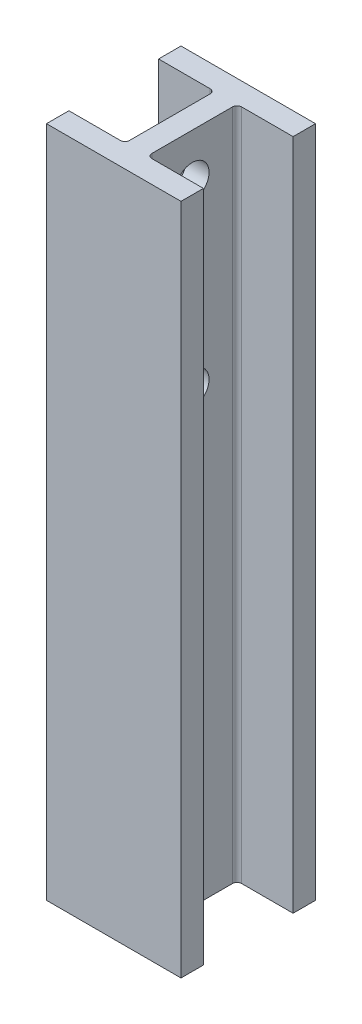
ISO-10303-21;
HEADER;
FILE_DESCRIPTION(('STEP AP214'),'2;1');
FILE_NAME('part.step','',(''),(''),'','','');
FILE_SCHEMA(('AUTOMOTIVE_DESIGN { 1 0 10303 214 1 1 1 1 }'));
ENDSEC;
DATA;
#1=APPLICATION_CONTEXT('core data for automotive mechanical design processes');
#2=APPLICATION_PROTOCOL_DEFINITION('international standard','automotive_design',2000,#1);
#3=PRODUCT_CONTEXT('',#1,'mechanical');
#4=PRODUCT('Part','Part','',(#3));
#5=PRODUCT_RELATED_PRODUCT_CATEGORY('part','',(#4));
#6=PRODUCT_DEFINITION_FORMATION('','',#4);
#7=PRODUCT_DEFINITION_CONTEXT('part definition',#1,'design');
#8=PRODUCT_DEFINITION('design','',#6,#7);
#9=PRODUCT_DEFINITION_SHAPE('','',#8);
#10=(LENGTH_UNIT() NAMED_UNIT(*) SI_UNIT(.MILLI.,.METRE.));
#11=(NAMED_UNIT(*) PLANE_ANGLE_UNIT() SI_UNIT($,.RADIAN.));
#12=(NAMED_UNIT(*) SI_UNIT($,.STERADIAN.) SOLID_ANGLE_UNIT());
#13=UNCERTAINTY_MEASURE_WITH_UNIT(LENGTH_MEASURE(1.E-05),#10,'distance_accuracy_value','');
#14=(GEOMETRIC_REPRESENTATION_CONTEXT(3) GLOBAL_UNCERTAINTY_ASSIGNED_CONTEXT((#13)) GLOBAL_UNIT_ASSIGNED_CONTEXT((#10,
#11,#12)) REPRESENTATION_CONTEXT('',''));
#15=CARTESIAN_POINT('',(0.,0.,0.));
#16=DIRECTION('',(0.,0.,1.));
#17=DIRECTION('',(1.,0.,0.));
#18=AXIS2_PLACEMENT_3D('',#15,#16,#17);
#19=CARTESIAN_POINT('',(0.,1500.,0.));
#20=DIRECTION('',(1.,0.,0.));
#21=DIRECTION('',(0.,0.,-1.));
#22=AXIS2_PLACEMENT_3D('',#19,#20,#21);
#23=PLANE('',#22);
#24=DIRECTION('',(0.,0.,1.));
#25=VECTOR('',#24,1.);
#26=CARTESIAN_POINT('',(0.,0.,0.));
#27=LINE('',#26,#25);
#28=CARTESIAN_POINT('',(0.,0.,-50.));
#29=VERTEX_POINT('',#28);
#30=CARTESIAN_POINT('',(0.,0.,0.));
#31=VERTEX_POINT('',#30);
#32=EDGE_CURVE('E166',#29,#31,#27,.T.);
#33=ORIENTED_EDGE('',*,*,#32,.T.);
#34=DIRECTION('',(0.,-1.,0.));
#35=VECTOR('',#34,1.);
#36=CARTESIAN_POINT('',(0.,1500.,0.));
#37=LINE('',#36,#35);
#38=CARTESIAN_POINT('',(0.,1500.,0.));
#39=VERTEX_POINT('',#38);
#40=EDGE_CURVE('E149',#39,#31,#37,.T.);
#41=ORIENTED_EDGE('',*,*,#40,.F.);
#42=DIRECTION('',(0.,0.,1.));
#43=VECTOR('',#42,1.);
#44=CARTESIAN_POINT('',(0.,1500.,0.));
#45=LINE('',#44,#43);
#46=CARTESIAN_POINT('',(0.,1500.,-50.));
#47=VERTEX_POINT('',#46);
#48=EDGE_CURVE('E155',#47,#39,#45,.T.);
#49=ORIENTED_EDGE('',*,*,#48,.F.);
#50=DIRECTION('',(0.,-1.,0.));
#51=VECTOR('',#50,1.);
#52=CARTESIAN_POINT('',(0.,1500.,-50.));
#53=LINE('',#52,#51);
#54=EDGE_CURVE('E216',#47,#29,#53,.T.);
#55=ORIENTED_EDGE('',*,*,#54,.T.);
#56=EDGE_LOOP('',(#33,#41,#49,#55));
#57=FACE_BOUND('',#56,.T.);
#58=ADVANCED_FACE('F33',(#57),#23,.F.);
#59=CARTESIAN_POINT('',(0.,1500.,0.));
#60=DIRECTION('',(0.,0.,-1.));
#61=DIRECTION('',(-1.,0.,0.));
#62=AXIS2_PLACEMENT_3D('',#59,#60,#61);
#63=PLANE('',#62);
#64=DIRECTION('',(1.,0.,0.));
#65=VECTOR('',#64,1.);
#66=CARTESIAN_POINT('',(0.,0.,0.));
#67=LINE('',#66,#65);
#68=CARTESIAN_POINT('',(300.,0.,0.));
#69=VERTEX_POINT('',#68);
#70=EDGE_CURVE('E226',#31,#69,#67,.T.);
#71=ORIENTED_EDGE('',*,*,#70,.T.);
#72=DIRECTION('',(0.,-1.,0.));
#73=VECTOR('',#72,1.);
#74=CARTESIAN_POINT('',(300.,1500.,0.));
#75=LINE('',#74,#73);
#76=CARTESIAN_POINT('',(300.,1500.,0.));
#77=VERTEX_POINT('',#76);
#78=EDGE_CURVE('E152',#77,#69,#75,.T.);
#79=ORIENTED_EDGE('',*,*,#78,.F.);
#80=DIRECTION('',(1.,0.,0.));
#81=VECTOR('',#80,1.);
#82=CARTESIAN_POINT('',(0.,1500.,0.));
#83=LINE('',#82,#81);
#84=EDGE_CURVE('E145',#39,#77,#83,.T.);
#85=ORIENTED_EDGE('',*,*,#84,.F.);
#86=ORIENTED_EDGE('',*,*,#40,.T.);
#87=EDGE_LOOP('',(#71,#79,#85,#86));
#88=FACE_BOUND('',#87,.T.);
#89=ADVANCED_FACE('F147',(#88),#63,.F.);
#90=CARTESIAN_POINT('',(300.,1500.,0.));
#91=DIRECTION('',(-1.,0.,0.));
#92=DIRECTION('',(0.,0.,1.));
#93=AXIS2_PLACEMENT_3D('',#90,#91,#92);
#94=PLANE('',#93);
#95=DIRECTION('',(0.,0.,-1.));
#96=VECTOR('',#95,1.);
#97=CARTESIAN_POINT('',(300.,0.,0.));
#98=LINE('',#97,#96);
#99=CARTESIAN_POINT('',(300.,0.,-50.));
#100=VERTEX_POINT('',#99);
#101=EDGE_CURVE('E229',#69,#100,#98,.T.);
#102=ORIENTED_EDGE('',*,*,#101,.T.);
#103=DIRECTION('',(0.,-1.,0.));
#104=VECTOR('',#103,1.);
#105=CARTESIAN_POINT('',(300.,1500.,-50.));
#106=LINE('',#105,#104);
#107=CARTESIAN_POINT('',(300.,1500.,-50.));
#108=VERTEX_POINT('',#107);
#109=EDGE_CURVE('E171',#108,#100,#106,.T.);
#110=ORIENTED_EDGE('',*,*,#109,.F.);
#111=DIRECTION('',(0.,0.,-1.));
#112=VECTOR('',#111,1.);
#113=CARTESIAN_POINT('',(300.,1500.,0.));
#114=LINE('',#113,#112);
#115=EDGE_CURVE('E154',#77,#108,#114,.T.);
#116=ORIENTED_EDGE('',*,*,#115,.F.);
#117=ORIENTED_EDGE('',*,*,#78,.T.);
#118=EDGE_LOOP('',(#102,#110,#116,#117));
#119=FACE_BOUND('',#118,.T.);
#120=ADVANCED_FACE('F336',(#119),#94,.F.);
#121=CARTESIAN_POINT('',(175.,1500.,-50.));
#122=DIRECTION('',(0.,0.,1.));
#123=DIRECTION('',(1.,0.,0.));
#124=AXIS2_PLACEMENT_3D('',#121,#122,#123);
#125=PLANE('',#124);
#126=DIRECTION('',(-1.,0.,0.));
#127=VECTOR('',#126,1.);
#128=CARTESIAN_POINT('',(175.,0.,-50.));
#129=LINE('',#128,#127);
#130=CARTESIAN_POINT('',(185.,0.,-50.));
#131=VERTEX_POINT('',#130);
#132=EDGE_CURVE('E231',#100,#131,#129,.T.);
#133=ORIENTED_EDGE('',*,*,#132,.T.);
#134=DIRECTION('',(0.,-1.,0.));
#135=VECTOR('',#134,1.);
#136=CARTESIAN_POINT('',(185.,1500.,-50.));
#137=LINE('',#136,#135);
#138=CARTESIAN_POINT('',(185.,1500.,-50.));
#139=VERTEX_POINT('',#138);
#140=EDGE_CURVE('E187',#131,#139,#137,.F.);
#141=ORIENTED_EDGE('',*,*,#140,.T.);
#142=DIRECTION('',(-1.,0.,0.));
#143=VECTOR('',#142,1.);
#144=CARTESIAN_POINT('',(175.,1500.,-50.));
#145=LINE('',#144,#143);
#146=EDGE_CURVE('E266',#108,#139,#145,.T.);
#147=ORIENTED_EDGE('',*,*,#146,.F.);
#148=ORIENTED_EDGE('',*,*,#109,.T.);
#149=EDGE_LOOP('',(#133,#141,#147,#148));
#150=FACE_BOUND('',#149,.T.);
#151=ADVANCED_FACE('F263',(#150),#125,.F.);
#152=CARTESIAN_POINT('',(175.,1500.,-50.));
#153=DIRECTION('',(-1.,0.,0.));
#154=DIRECTION('',(0.,0.,1.));
#155=AXIS2_PLACEMENT_3D('',#152,#153,#154);
#156=PLANE('',#155);
#157=CARTESIAN_POINT('',(175.,1400.,-150.));
#158=DIRECTION('',(-1.,0.,0.));
#159=DIRECTION('',(0.,0.,1.));
#160=AXIS2_PLACEMENT_3D('',#157,#158,#159);
#161=CIRCLE('',#160,37.4999999999999);
#162=CARTESIAN_POINT('',(175.,1400.,-112.5));
#163=VERTEX_POINT('',#162);
#164=EDGE_CURVE('E227',#163,#163,#161,.T.);
#165=ORIENTED_EDGE('',*,*,#164,.T.);
#166=EDGE_LOOP('',(#165));
#167=FACE_BOUND('',#166,.T.);
#168=CARTESIAN_POINT('',(175.,1000.,-150.));
#169=DIRECTION('',(-1.,0.,0.));
#170=DIRECTION('',(0.,0.,1.));
#171=AXIS2_PLACEMENT_3D('',#168,#169,#170);
#172=CIRCLE('',#171,37.5);
#173=CARTESIAN_POINT('',(175.,1000.,-112.5));
#174=VERTEX_POINT('',#173);
#175=EDGE_CURVE('E380',#174,#174,#172,.T.);
#176=ORIENTED_EDGE('',*,*,#175,.T.);
#177=EDGE_LOOP('',(#176));
#178=FACE_BOUND('',#177,.T.);
#179=DIRECTION('',(0.,0.,-1.));
#180=VECTOR('',#179,1.);
#181=CARTESIAN_POINT('',(175.,0.,-50.));
#182=LINE('',#181,#180);
#183=CARTESIAN_POINT('',(175.,0.,-60.));
#184=VERTEX_POINT('',#183);
#185=CARTESIAN_POINT('',(175.,0.,-240.));
#186=VERTEX_POINT('',#185);
#187=EDGE_CURVE('E234',#184,#186,#182,.T.);
#188=ORIENTED_EDGE('',*,*,#187,.T.);
#189=DIRECTION('',(0.,-1.,0.));
#190=VECTOR('',#189,1.);
#191=CARTESIAN_POINT('',(175.,1500.,-240.));
#192=LINE('',#191,#190);
#193=CARTESIAN_POINT('',(175.,1500.,-240.));
#194=VERTEX_POINT('',#193);
#195=EDGE_CURVE('E185',#186,#194,#192,.F.);
#196=ORIENTED_EDGE('',*,*,#195,.T.);
#197=DIRECTION('',(0.,0.,-1.));
#198=VECTOR('',#197,1.);
#199=CARTESIAN_POINT('',(175.,1500.,-50.));
#200=LINE('',#199,#198);
#201=CARTESIAN_POINT('',(175.,1500.,-60.));
#202=VERTEX_POINT('',#201);
#203=EDGE_CURVE('E279',#202,#194,#200,.T.);
#204=ORIENTED_EDGE('',*,*,#203,.F.);
#205=DIRECTION('',(0.,-1.,0.));
#206=VECTOR('',#205,1.);
#207=CARTESIAN_POINT('',(175.,0.,-60.));
#208=LINE('',#207,#206);
#209=EDGE_CURVE('E182',#202,#184,#208,.T.);
#210=ORIENTED_EDGE('',*,*,#209,.T.);
#211=EDGE_LOOP('',(#188,#196,#204,#210));
#212=FACE_BOUND('',#211,.T.);
#213=ADVANCED_FACE('F276',(#167,#178,#212),#156,.F.);
#214=CARTESIAN_POINT('',(175.,1500.,-250.));
#215=DIRECTION('',(0.,0.,-1.));
#216=DIRECTION('',(-1.,0.,0.));
#217=AXIS2_PLACEMENT_3D('',#214,#215,#216);
#218=PLANE('',#217);
#219=DIRECTION('',(1.,0.,0.));
#220=VECTOR('',#219,1.);
#221=CARTESIAN_POINT('',(175.,1500.,-250.));
#222=LINE('',#221,#220);
#223=CARTESIAN_POINT('',(185.,1500.,-250.));
#224=VERTEX_POINT('',#223);
#225=CARTESIAN_POINT('',(300.,1500.,-250.));
#226=VERTEX_POINT('',#225);
#227=EDGE_CURVE('E281',#224,#226,#222,.T.);
#228=ORIENTED_EDGE('',*,*,#227,.F.);
#229=DIRECTION('',(0.,-1.,0.));
#230=VECTOR('',#229,1.);
#231=CARTESIAN_POINT('',(185.,0.,-250.));
#232=LINE('',#231,#230);
#233=CARTESIAN_POINT('',(185.,0.,-250.));
#234=VERTEX_POINT('',#233);
#235=EDGE_CURVE('E179',#224,#234,#232,.T.);
#236=ORIENTED_EDGE('',*,*,#235,.T.);
#237=DIRECTION('',(1.,0.,0.));
#238=VECTOR('',#237,1.);
#239=CARTESIAN_POINT('',(175.,0.,-250.));
#240=LINE('',#239,#238);
#241=CARTESIAN_POINT('',(300.,0.,-250.));
#242=VERTEX_POINT('',#241);
#243=EDGE_CURVE('E237',#234,#242,#240,.T.);
#244=ORIENTED_EDGE('',*,*,#243,.T.);
#245=DIRECTION('',(0.,-1.,0.));
#246=VECTOR('',#245,1.);
#247=CARTESIAN_POINT('',(300.,1500.,-250.));
#248=LINE('',#247,#246);
#249=EDGE_CURVE('E256',#226,#242,#248,.T.);
#250=ORIENTED_EDGE('',*,*,#249,.F.);
#251=EDGE_LOOP('',(#228,#236,#244,#250));
#252=FACE_BOUND('',#251,.T.);
#253=ADVANCED_FACE('F320',(#252),#218,.F.);
#254=CARTESIAN_POINT('',(300.,1500.,-250.));
#255=DIRECTION('',(-1.,0.,0.));
#256=DIRECTION('',(0.,0.,1.));
#257=AXIS2_PLACEMENT_3D('',#254,#255,#256);
#258=PLANE('',#257);
#259=DIRECTION('',(0.,0.,-1.));
#260=VECTOR('',#259,1.);
#261=CARTESIAN_POINT('',(300.,0.,-250.));
#262=LINE('',#261,#260);
#263=CARTESIAN_POINT('',(300.,0.,-300.));
#264=VERTEX_POINT('',#263);
#265=EDGE_CURVE('E239',#242,#264,#262,.T.);
#266=ORIENTED_EDGE('',*,*,#265,.T.);
#267=DIRECTION('',(0.,-1.,0.));
#268=VECTOR('',#267,1.);
#269=CARTESIAN_POINT('',(300.,1500.,-300.));
#270=LINE('',#269,#268);
#271=CARTESIAN_POINT('',(300.,1500.,-300.));
#272=VERTEX_POINT('',#271);
#273=EDGE_CURVE('E253',#272,#264,#270,.T.);
#274=ORIENTED_EDGE('',*,*,#273,.F.);
#275=DIRECTION('',(0.,0.,-1.));
#276=VECTOR('',#275,1.);
#277=CARTESIAN_POINT('',(300.,1500.,-250.));
#278=LINE('',#277,#276);
#279=EDGE_CURVE('E283',#226,#272,#278,.T.);
#280=ORIENTED_EDGE('',*,*,#279,.F.);
#281=ORIENTED_EDGE('',*,*,#249,.T.);
#282=EDGE_LOOP('',(#266,#274,#280,#281));
#283=FACE_BOUND('',#282,.T.);
#284=ADVANCED_FACE('F316',(#283),#258,.F.);
#285=CARTESIAN_POINT('',(0.,1500.,-300.));
#286=DIRECTION('',(0.,0.,1.));
#287=DIRECTION('',(1.,0.,0.));
#288=AXIS2_PLACEMENT_3D('',#285,#286,#287);
#289=PLANE('',#288);
#290=DIRECTION('',(-1.,0.,0.));
#291=VECTOR('',#290,1.);
#292=CARTESIAN_POINT('',(0.,0.,-300.));
#293=LINE('',#292,#291);
#294=CARTESIAN_POINT('',(0.,0.,-300.));
#295=VERTEX_POINT('',#294);
#296=EDGE_CURVE('E241',#264,#295,#293,.T.);
#297=ORIENTED_EDGE('',*,*,#296,.T.);
#298=DIRECTION('',(0.,-1.,0.));
#299=VECTOR('',#298,1.);
#300=CARTESIAN_POINT('',(0.,1500.,-300.));
#301=LINE('',#300,#299);
#302=CARTESIAN_POINT('',(0.,1500.,-300.));
#303=VERTEX_POINT('',#302);
#304=EDGE_CURVE('E250',#303,#295,#301,.T.);
#305=ORIENTED_EDGE('',*,*,#304,.F.);
#306=DIRECTION('',(-1.,0.,0.));
#307=VECTOR('',#306,1.);
#308=CARTESIAN_POINT('',(0.,1500.,-300.));
#309=LINE('',#308,#307);
#310=EDGE_CURVE('E289',#272,#303,#309,.T.);
#311=ORIENTED_EDGE('',*,*,#310,.F.);
#312=ORIENTED_EDGE('',*,*,#273,.T.);
#313=EDGE_LOOP('',(#297,#305,#311,#312));
#314=FACE_BOUND('',#313,.T.);
#315=ADVANCED_FACE('F311',(#314),#289,.F.);
#316=CARTESIAN_POINT('',(0.,1500.,-250.));
#317=DIRECTION('',(1.,0.,0.));
#318=DIRECTION('',(0.,0.,-1.));
#319=AXIS2_PLACEMENT_3D('',#316,#317,#318);
#320=PLANE('',#319);
#321=DIRECTION('',(0.,0.,1.));
#322=VECTOR('',#321,1.);
#323=CARTESIAN_POINT('',(0.,0.,-250.));
#324=LINE('',#323,#322);
#325=CARTESIAN_POINT('',(0.,0.,-250.));
#326=VERTEX_POINT('',#325);
#327=EDGE_CURVE('E243',#295,#326,#324,.T.);
#328=ORIENTED_EDGE('',*,*,#327,.T.);
#329=DIRECTION('',(0.,-1.,0.));
#330=VECTOR('',#329,1.);
#331=CARTESIAN_POINT('',(0.,1500.,-250.));
#332=LINE('',#331,#330);
#333=CARTESIAN_POINT('',(0.,1500.,-250.));
#334=VERTEX_POINT('',#333);
#335=EDGE_CURVE('E219',#334,#326,#332,.T.);
#336=ORIENTED_EDGE('',*,*,#335,.F.);
#337=DIRECTION('',(0.,0.,1.));
#338=VECTOR('',#337,1.);
#339=CARTESIAN_POINT('',(0.,1500.,-250.));
#340=LINE('',#339,#338);
#341=EDGE_CURVE('E291',#303,#334,#340,.T.);
#342=ORIENTED_EDGE('',*,*,#341,.F.);
#343=ORIENTED_EDGE('',*,*,#304,.T.);
#344=EDGE_LOOP('',(#328,#336,#342,#343));
#345=FACE_BOUND('',#344,.T.);
#346=ADVANCED_FACE('F305',(#345),#320,.F.);
#347=CARTESIAN_POINT('',(0.,1500.,-250.));
#348=DIRECTION('',(0.,0.,-1.));
#349=DIRECTION('',(-1.,0.,0.));
#350=AXIS2_PLACEMENT_3D('',#347,#348,#349);
#351=PLANE('',#350);
#352=DIRECTION('',(1.,0.,0.));
#353=VECTOR('',#352,1.);
#354=CARTESIAN_POINT('',(0.,0.,-250.));
#355=LINE('',#354,#353);
#356=CARTESIAN_POINT('',(115.,0.,-250.));
#357=VERTEX_POINT('',#356);
#358=EDGE_CURVE('E212',#326,#357,#355,.T.);
#359=ORIENTED_EDGE('',*,*,#358,.T.);
#360=DIRECTION('',(0.,-1.,0.));
#361=VECTOR('',#360,1.);
#362=CARTESIAN_POINT('',(115.,1500.,-250.));
#363=LINE('',#362,#361);
#364=CARTESIAN_POINT('',(115.,1500.,-250.));
#365=VERTEX_POINT('',#364);
#366=EDGE_CURVE('E177',#357,#365,#363,.F.);
#367=ORIENTED_EDGE('',*,*,#366,.T.);
#368=DIRECTION('',(1.,0.,0.));
#369=VECTOR('',#368,1.);
#370=CARTESIAN_POINT('',(0.,1500.,-250.));
#371=LINE('',#370,#369);
#372=EDGE_CURVE('E221',#334,#365,#371,.T.);
#373=ORIENTED_EDGE('',*,*,#372,.F.);
#374=ORIENTED_EDGE('',*,*,#335,.T.);
#375=EDGE_LOOP('',(#359,#367,#373,#374));
#376=FACE_BOUND('',#375,.T.);
#377=ADVANCED_FACE('F303',(#376),#351,.F.);
#378=CARTESIAN_POINT('',(125.,1500.,-50.));
#379=DIRECTION('',(1.,0.,0.));
#380=DIRECTION('',(0.,0.,-1.));
#381=AXIS2_PLACEMENT_3D('',#378,#379,#380);
#382=PLANE('',#381);
#383=CARTESIAN_POINT('',(125.,1400.,-150.));
#384=DIRECTION('',(-1.,0.,0.));
#385=DIRECTION('',(0.,0.,1.));
#386=AXIS2_PLACEMENT_3D('',#383,#384,#385);
#387=CIRCLE('',#386,37.4999999999999);
#388=CARTESIAN_POINT('',(125.,1400.,-112.5));
#389=VERTEX_POINT('',#388);
#390=EDGE_CURVE('E377',#389,#389,#387,.T.);
#391=ORIENTED_EDGE('',*,*,#390,.F.);
#392=EDGE_LOOP('',(#391));
#393=FACE_BOUND('',#392,.T.);
#394=CARTESIAN_POINT('',(125.,1000.,-150.));
#395=DIRECTION('',(-1.,0.,0.));
#396=DIRECTION('',(0.,0.,1.));
#397=AXIS2_PLACEMENT_3D('',#394,#395,#396);
#398=CIRCLE('',#397,37.5);
#399=CARTESIAN_POINT('',(125.,1000.,-112.5));
#400=VERTEX_POINT('',#399);
#401=EDGE_CURVE('E385',#400,#400,#398,.T.);
#402=ORIENTED_EDGE('',*,*,#401,.F.);
#403=EDGE_LOOP('',(#402));
#404=FACE_BOUND('',#403,.T.);
#405=DIRECTION('',(0.,0.,1.));
#406=VECTOR('',#405,1.);
#407=CARTESIAN_POINT('',(125.,1500.,-50.));
#408=LINE('',#407,#406);
#409=CARTESIAN_POINT('',(125.,1500.,-240.));
#410=VERTEX_POINT('',#409);
#411=CARTESIAN_POINT('',(125.,1500.,-60.));
#412=VERTEX_POINT('',#411);
#413=EDGE_CURVE('E217',#410,#412,#408,.T.);
#414=ORIENTED_EDGE('',*,*,#413,.F.);
#415=DIRECTION('',(0.,-1.,0.));
#416=VECTOR('',#415,1.);
#417=CARTESIAN_POINT('',(125.,0.,-240.));
#418=LINE('',#417,#416);
#419=CARTESIAN_POINT('',(125.,0.,-240.));
#420=VERTEX_POINT('',#419);
#421=EDGE_CURVE('E169',#410,#420,#418,.T.);
#422=ORIENTED_EDGE('',*,*,#421,.T.);
#423=DIRECTION('',(0.,0.,1.));
#424=VECTOR('',#423,1.);
#425=CARTESIAN_POINT('',(125.,0.,-50.));
#426=LINE('',#425,#424);
#427=CARTESIAN_POINT('',(125.,0.,-60.));
#428=VERTEX_POINT('',#427);
#429=EDGE_CURVE('E207',#420,#428,#426,.T.);
#430=ORIENTED_EDGE('',*,*,#429,.T.);
#431=DIRECTION('',(0.,-1.,0.));
#432=VECTOR('',#431,1.);
#433=CARTESIAN_POINT('',(125.,1500.,-60.));
#434=LINE('',#433,#432);
#435=EDGE_CURVE('E167',#428,#412,#434,.F.);
#436=ORIENTED_EDGE('',*,*,#435,.T.);
#437=EDGE_LOOP('',(#414,#422,#430,#436));
#438=FACE_BOUND('',#437,.T.);
#439=ADVANCED_FACE('F210',(#393,#404,#438),#382,.F.);
#440=CARTESIAN_POINT('',(0.,1500.,-50.));
#441=DIRECTION('',(0.,0.,1.));
#442=DIRECTION('',(1.,0.,0.));
#443=AXIS2_PLACEMENT_3D('',#440,#441,#442);
#444=PLANE('',#443);
#445=DIRECTION('',(-1.,0.,0.));
#446=VECTOR('',#445,1.);
#447=CARTESIAN_POINT('',(0.,1500.,-50.));
#448=LINE('',#447,#446);
#449=CARTESIAN_POINT('',(115.,1500.,-50.));
#450=VERTEX_POINT('',#449);
#451=EDGE_CURVE('E159',#450,#47,#448,.T.);
#452=ORIENTED_EDGE('',*,*,#451,.F.);
#453=DIRECTION('',(0.,-1.,0.));
#454=VECTOR('',#453,1.);
#455=CARTESIAN_POINT('',(115.,0.,-50.));
#456=LINE('',#455,#454);
#457=CARTESIAN_POINT('',(115.,0.,-50.));
#458=VERTEX_POINT('',#457);
#459=EDGE_CURVE('E189',#450,#458,#456,.T.);
#460=ORIENTED_EDGE('',*,*,#459,.T.);
#461=DIRECTION('',(-1.,0.,0.));
#462=VECTOR('',#461,1.);
#463=CARTESIAN_POINT('',(0.,0.,-50.));
#464=LINE('',#463,#462);
#465=EDGE_CURVE('E163',#458,#29,#464,.T.);
#466=ORIENTED_EDGE('',*,*,#465,.T.);
#467=ORIENTED_EDGE('',*,*,#54,.F.);
#468=EDGE_LOOP('',(#452,#460,#466,#467));
#469=FACE_BOUND('',#468,.T.);
#470=ADVANCED_FACE('F215',(#469),#444,.F.);
#471=CARTESIAN_POINT('',(0.,1500.,0.));
#472=DIRECTION('',(0.,-1.,0.));
#473=DIRECTION('',(0.,0.,-1.));
#474=AXIS2_PLACEMENT_3D('',#471,#472,#473);
#475=PLANE('',#474);
#476=ORIENTED_EDGE('',*,*,#48,.T.);
#477=ORIENTED_EDGE('',*,*,#84,.T.);
#478=ORIENTED_EDGE('',*,*,#115,.T.);
#479=ORIENTED_EDGE('',*,*,#146,.T.);
#480=CARTESIAN_POINT('',(185.,1500.,-60.));
#481=DIRECTION('',(0.,-1.,0.));
#482=DIRECTION('',(0.,0.,-1.));
#483=AXIS2_PLACEMENT_3D('',#480,#481,#482);
#484=CIRCLE('',#483,10.);
#485=EDGE_CURVE('E201',#139,#202,#484,.T.);
#486=ORIENTED_EDGE('',*,*,#485,.T.);
#487=ORIENTED_EDGE('',*,*,#203,.T.);
#488=CARTESIAN_POINT('',(185.,1500.,-240.));
#489=DIRECTION('',(0.,-1.,0.));
#490=DIRECTION('',(0.,0.,-1.));
#491=AXIS2_PLACEMENT_3D('',#488,#489,#490);
#492=CIRCLE('',#491,10.);
#493=EDGE_CURVE('E197',#194,#224,#492,.T.);
#494=ORIENTED_EDGE('',*,*,#493,.T.);
#495=ORIENTED_EDGE('',*,*,#227,.T.);
#496=ORIENTED_EDGE('',*,*,#279,.T.);
#497=ORIENTED_EDGE('',*,*,#310,.T.);
#498=ORIENTED_EDGE('',*,*,#341,.T.);
#499=ORIENTED_EDGE('',*,*,#372,.T.);
#500=CARTESIAN_POINT('',(115.,1500.,-240.));
#501=DIRECTION('',(0.,-1.,0.));
#502=DIRECTION('',(0.,0.,-1.));
#503=AXIS2_PLACEMENT_3D('',#500,#501,#502);
#504=CIRCLE('',#503,10.);
#505=EDGE_CURVE('E193',#365,#410,#504,.T.);
#506=ORIENTED_EDGE('',*,*,#505,.T.);
#507=ORIENTED_EDGE('',*,*,#413,.T.);
#508=CARTESIAN_POINT('',(115.,1500.,-60.));
#509=DIRECTION('',(0.,-1.,0.));
#510=DIRECTION('',(0.,0.,-1.));
#511=AXIS2_PLACEMENT_3D('',#508,#509,#510);
#512=CIRCLE('',#511,10.);
#513=EDGE_CURVE('E11',#412,#450,#512,.T.);
#514=ORIENTED_EDGE('',*,*,#513,.T.);
#515=ORIENTED_EDGE('',*,*,#451,.T.);
#516=EDGE_LOOP('',(#476,#477,#478,#479,#486,#487,#494,#495,#496,#497,#498,#499,#506,#507,#514,#515));
#517=FACE_BOUND('',#516,.T.);
#518=ADVANCED_FACE('F158',(#517),#475,.F.);
#519=CARTESIAN_POINT('',(0.,0.,0.));
#520=DIRECTION('',(0.,-1.,0.));
#521=DIRECTION('',(0.,0.,-1.));
#522=AXIS2_PLACEMENT_3D('',#519,#520,#521);
#523=PLANE('',#522);
#524=ORIENTED_EDGE('',*,*,#32,.F.);
#525=ORIENTED_EDGE('',*,*,#465,.F.);
#526=CARTESIAN_POINT('',(115.,0.,-60.));
#527=DIRECTION('',(0.,-1.,0.));
#528=DIRECTION('',(0.,0.,-1.));
#529=AXIS2_PLACEMENT_3D('',#526,#527,#528);
#530=CIRCLE('',#529,10.);
#531=EDGE_CURVE('E41',#458,#428,#530,.F.);
#532=ORIENTED_EDGE('',*,*,#531,.T.);
#533=ORIENTED_EDGE('',*,*,#429,.F.);
#534=CARTESIAN_POINT('',(115.,0.,-240.));
#535=DIRECTION('',(0.,-1.,0.));
#536=DIRECTION('',(0.,0.,-1.));
#537=AXIS2_PLACEMENT_3D('',#534,#535,#536);
#538=CIRCLE('',#537,10.);
#539=EDGE_CURVE('E191',#420,#357,#538,.F.);
#540=ORIENTED_EDGE('',*,*,#539,.T.);
#541=ORIENTED_EDGE('',*,*,#358,.F.);
#542=ORIENTED_EDGE('',*,*,#327,.F.);
#543=ORIENTED_EDGE('',*,*,#296,.F.);
#544=ORIENTED_EDGE('',*,*,#265,.F.);
#545=ORIENTED_EDGE('',*,*,#243,.F.);
#546=CARTESIAN_POINT('',(185.,0.,-240.));
#547=DIRECTION('',(0.,-1.,0.));
#548=DIRECTION('',(0.,0.,-1.));
#549=AXIS2_PLACEMENT_3D('',#546,#547,#548);
#550=CIRCLE('',#549,10.);
#551=EDGE_CURVE('E195',#234,#186,#550,.F.);
#552=ORIENTED_EDGE('',*,*,#551,.T.);
#553=ORIENTED_EDGE('',*,*,#187,.F.);
#554=CARTESIAN_POINT('',(185.,0.,-60.));
#555=DIRECTION('',(0.,-1.,0.));
#556=DIRECTION('',(0.,0.,-1.));
#557=AXIS2_PLACEMENT_3D('',#554,#555,#556);
#558=CIRCLE('',#557,10.);
#559=EDGE_CURVE('E199',#184,#131,#558,.F.);
#560=ORIENTED_EDGE('',*,*,#559,.T.);
#561=ORIENTED_EDGE('',*,*,#132,.F.);
#562=ORIENTED_EDGE('',*,*,#101,.F.);
#563=ORIENTED_EDGE('',*,*,#70,.F.);
#564=EDGE_LOOP('',(#524,#525,#532,#533,#540,#541,#542,#543,#544,#545,#552,#553,#560,#561,#562,#563));
#565=FACE_BOUND('',#564,.T.);
#566=ADVANCED_FACE('F206',(#565),#523,.T.);
#567=CARTESIAN_POINT('',(115.,1500.,-240.));
#568=DIRECTION('',(0.,1.,0.));
#569=DIRECTION('',(0.,0.,1.));
#570=AXIS2_PLACEMENT_3D('',#567,#568,#569);
#571=CYLINDRICAL_SURFACE('',#570,10.);
#572=ORIENTED_EDGE('',*,*,#505,.F.);
#573=ORIENTED_EDGE('',*,*,#366,.F.);
#574=ORIENTED_EDGE('',*,*,#539,.F.);
#575=ORIENTED_EDGE('',*,*,#421,.F.);
#576=EDGE_LOOP('',(#572,#573,#574,#575));
#577=FACE_BOUND('',#576,.T.);
#578=ADVANCED_FACE('F300',(#577),#571,.F.);
#579=CARTESIAN_POINT('',(185.,1500.,-240.));
#580=DIRECTION('',(0.,1.,0.));
#581=DIRECTION('',(0.,0.,1.));
#582=AXIS2_PLACEMENT_3D('',#579,#580,#581);
#583=CYLINDRICAL_SURFACE('',#582,10.);
#584=ORIENTED_EDGE('',*,*,#493,.F.);
#585=ORIENTED_EDGE('',*,*,#195,.F.);
#586=ORIENTED_EDGE('',*,*,#551,.F.);
#587=ORIENTED_EDGE('',*,*,#235,.F.);
#588=EDGE_LOOP('',(#584,#585,#586,#587));
#589=FACE_BOUND('',#588,.T.);
#590=ADVANCED_FACE('F323',(#589),#583,.F.);
#591=CARTESIAN_POINT('',(185.,1500.,-60.));
#592=DIRECTION('',(0.,1.,0.));
#593=DIRECTION('',(0.,0.,1.));
#594=AXIS2_PLACEMENT_3D('',#591,#592,#593);
#595=CYLINDRICAL_SURFACE('',#594,10.);
#596=ORIENTED_EDGE('',*,*,#485,.F.);
#597=ORIENTED_EDGE('',*,*,#140,.F.);
#598=ORIENTED_EDGE('',*,*,#559,.F.);
#599=ORIENTED_EDGE('',*,*,#209,.F.);
#600=EDGE_LOOP('',(#596,#597,#598,#599));
#601=FACE_BOUND('',#600,.T.);
#602=ADVANCED_FACE('F273',(#601),#595,.F.);
#603=CARTESIAN_POINT('',(115.,1500.,-60.));
#604=DIRECTION('',(0.,1.,0.));
#605=DIRECTION('',(0.,0.,1.));
#606=AXIS2_PLACEMENT_3D('',#603,#604,#605);
#607=CYLINDRICAL_SURFACE('',#606,10.);
#608=ORIENTED_EDGE('',*,*,#513,.F.);
#609=ORIENTED_EDGE('',*,*,#435,.F.);
#610=ORIENTED_EDGE('',*,*,#531,.F.);
#611=ORIENTED_EDGE('',*,*,#459,.F.);
#612=EDGE_LOOP('',(#608,#609,#610,#611));
#613=FACE_BOUND('',#612,.T.);
#614=ADVANCED_FACE('F35',(#613),#607,.F.);
#615=CARTESIAN_POINT('',(300.,1000.,-150.));
#616=DIRECTION('',(-1.,0.,0.));
#617=DIRECTION('',(0.,0.,1.));
#618=AXIS2_PLACEMENT_3D('',#615,#616,#617);
#619=CYLINDRICAL_SURFACE('',#618,37.5);
#620=ORIENTED_EDGE('',*,*,#401,.T.);
#621=EDGE_LOOP('',(#620));
#622=FACE_BOUND('',#621,.T.);
#623=ORIENTED_EDGE('',*,*,#175,.F.);
#624=EDGE_LOOP('',(#623));
#625=FACE_BOUND('',#624,.T.);
#626=ADVANCED_FACE('F365',(#622,#625),#619,.F.);
#627=CARTESIAN_POINT('',(300.,1400.,-150.));
#628=DIRECTION('',(-1.,0.,0.));
#629=DIRECTION('',(0.,0.,1.));
#630=AXIS2_PLACEMENT_3D('',#627,#628,#629);
#631=CYLINDRICAL_SURFACE('',#630,37.4999999999999);
#632=ORIENTED_EDGE('',*,*,#390,.T.);
#633=EDGE_LOOP('',(#632));
#634=FACE_BOUND('',#633,.T.);
#635=ORIENTED_EDGE('',*,*,#164,.F.);
#636=EDGE_LOOP('',(#635));
#637=FACE_BOUND('',#636,.T.);
#638=ADVANCED_FACE('F368',(#634,#637),#631,.F.);
#639=CLOSED_SHELL('',(#58,#89,#120,#151,#213,#253,#284,#315,#346,#377,#439,#470,#518,#566,#578,
#590,#602,#614,#626,#638));
#640=MANIFOLD_SOLID_BREP('B2',#639);
#641=ADVANCED_BREP_SHAPE_REPRESENTATION('',(#18,#640),#14);
#642=SHAPE_DEFINITION_REPRESENTATION(#9,#641);
ENDSEC;
END-ISO-10303-21;
